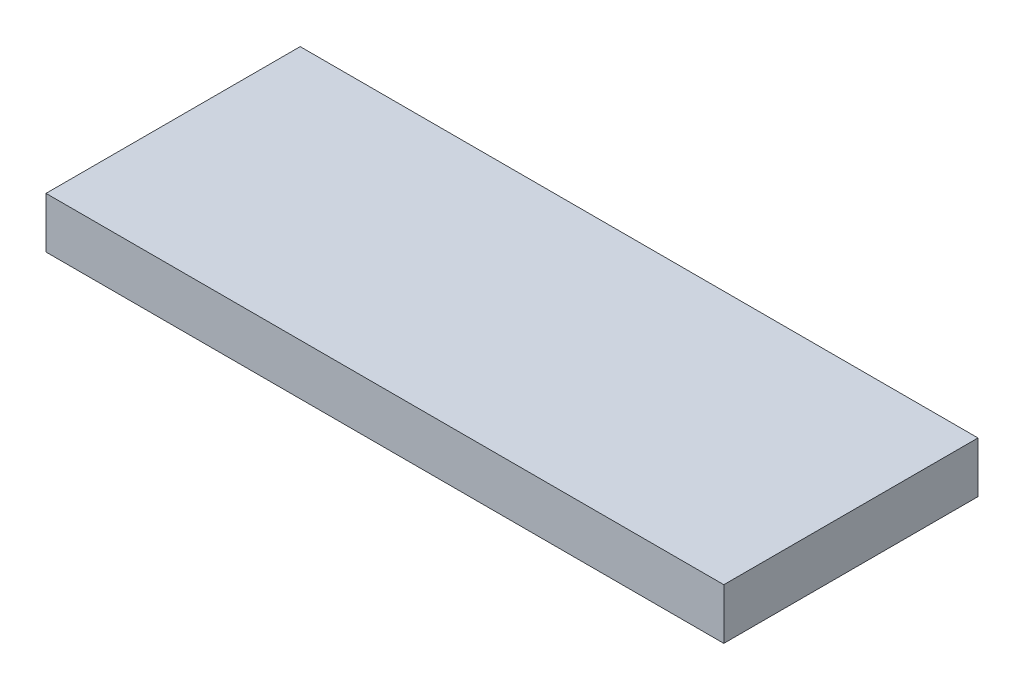
ISO-10303-21;
HEADER;
FILE_DESCRIPTION(('STEP AP214'),'2;1');
FILE_NAME('part.step','',(''),(''),'','','');
FILE_SCHEMA(('AUTOMOTIVE_DESIGN { 1 0 10303 214 1 1 1 1 }'));
ENDSEC;
DATA;
#1=APPLICATION_CONTEXT('core data for automotive mechanical design processes');
#2=APPLICATION_PROTOCOL_DEFINITION('international standard','automotive_design',2000,#1);
#3=PRODUCT_CONTEXT('',#1,'mechanical');
#4=PRODUCT('Part','Part','',(#3));
#5=PRODUCT_RELATED_PRODUCT_CATEGORY('part','',(#4));
#6=PRODUCT_DEFINITION_FORMATION('','',#4);
#7=PRODUCT_DEFINITION_CONTEXT('part definition',#1,'design');
#8=PRODUCT_DEFINITION('design','',#6,#7);
#9=PRODUCT_DEFINITION_SHAPE('','',#8);
#10=(LENGTH_UNIT() NAMED_UNIT(*) SI_UNIT(.MILLI.,.METRE.));
#11=(NAMED_UNIT(*) PLANE_ANGLE_UNIT() SI_UNIT($,.RADIAN.));
#12=(NAMED_UNIT(*) SI_UNIT($,.STERADIAN.) SOLID_ANGLE_UNIT());
#13=UNCERTAINTY_MEASURE_WITH_UNIT(LENGTH_MEASURE(1.E-05),#10,'distance_accuracy_value','');
#14=(GEOMETRIC_REPRESENTATION_CONTEXT(3) GLOBAL_UNCERTAINTY_ASSIGNED_CONTEXT((#13)) GLOBAL_UNIT_ASSIGNED_CONTEXT((#10,
#11,#12)) REPRESENTATION_CONTEXT('',''));
#15=CARTESIAN_POINT('',(0.,0.,0.));
#16=DIRECTION('',(0.,0.,1.));
#17=DIRECTION('',(1.,0.,0.));
#18=AXIS2_PLACEMENT_3D('',#15,#16,#17);
#19=CARTESIAN_POINT('',(20.,-16.2700500005556,-15.));
#20=DIRECTION('',(-1.,0.,0.));
#21=DIRECTION('',(0.,0.,1.));
#22=AXIS2_PLACEMENT_3D('',#19,#20,#21);
#23=PLANE('',#22);
#24=DIRECTION('',(0.,-1.,0.));
#25=VECTOR('',#24,1.);
#26=CARTESIAN_POINT('',(20.,-16.2700500005556,0.));
#27=LINE('',#26,#25);
#28=CARTESIAN_POINT('',(20.,-13.2700500005556,0.));
#29=VERTEX_POINT('',#28);
#30=CARTESIAN_POINT('',(20.,-16.2700500005556,0.));
#31=VERTEX_POINT('',#30);
#32=EDGE_CURVE('E102',#29,#31,#27,.T.);
#33=ORIENTED_EDGE('',*,*,#32,.T.);
#34=DIRECTION('',(0.,0.,1.));
#35=VECTOR('',#34,1.);
#36=CARTESIAN_POINT('',(20.,-16.2700500005556,-15.));
#37=LINE('',#36,#35);
#38=CARTESIAN_POINT('',(20.,-16.2700500005556,-15.));
#39=VERTEX_POINT('',#38);
#40=EDGE_CURVE('E11',#39,#31,#37,.T.);
#41=ORIENTED_EDGE('',*,*,#40,.F.);
#42=DIRECTION('',(0.,-1.,0.));
#43=VECTOR('',#42,1.);
#44=CARTESIAN_POINT('',(20.,-16.2700500005556,-15.));
#45=LINE('',#44,#43);
#46=CARTESIAN_POINT('',(20.,-13.2700500005556,-15.));
#47=VERTEX_POINT('',#46);
#48=EDGE_CURVE('E90',#47,#39,#45,.T.);
#49=ORIENTED_EDGE('',*,*,#48,.F.);
#50=DIRECTION('',(0.,0.,1.));
#51=VECTOR('',#50,1.);
#52=CARTESIAN_POINT('',(20.,-13.2700500005556,-15.));
#53=LINE('',#52,#51);
#54=EDGE_CURVE('E98',#47,#29,#53,.T.);
#55=ORIENTED_EDGE('',*,*,#54,.T.);
#56=EDGE_LOOP('',(#33,#41,#49,#55));
#57=FACE_BOUND('',#56,.T.);
#58=ADVANCED_FACE('F39',(#57),#23,.F.);
#59=CARTESIAN_POINT('',(20.,-16.2700500005556,-15.));
#60=DIRECTION('',(0.,1.,0.));
#61=DIRECTION('',(0.,0.,1.));
#62=AXIS2_PLACEMENT_3D('',#59,#60,#61);
#63=PLANE('',#62);
#64=DIRECTION('',(-1.,0.,0.));
#65=VECTOR('',#64,1.);
#66=CARTESIAN_POINT('',(20.,-16.2700500005556,0.));
#67=LINE('',#66,#65);
#68=CARTESIAN_POINT('',(-20.,-16.2700500005556,0.));
#69=VERTEX_POINT('',#68);
#70=EDGE_CURVE('E94',#31,#69,#67,.T.);
#71=ORIENTED_EDGE('',*,*,#70,.T.);
#72=DIRECTION('',(0.,0.,1.));
#73=VECTOR('',#72,1.);
#74=CARTESIAN_POINT('',(-20.,-16.2700500005556,-15.));
#75=LINE('',#74,#73);
#76=CARTESIAN_POINT('',(-20.,-16.2700500005556,-15.));
#77=VERTEX_POINT('',#76);
#78=EDGE_CURVE('E47',#77,#69,#75,.T.);
#79=ORIENTED_EDGE('',*,*,#78,.F.);
#80=DIRECTION('',(-1.,0.,0.));
#81=VECTOR('',#80,1.);
#82=CARTESIAN_POINT('',(20.,-16.2700500005556,-15.));
#83=LINE('',#82,#81);
#84=EDGE_CURVE('E85',#39,#77,#83,.T.);
#85=ORIENTED_EDGE('',*,*,#84,.F.);
#86=ORIENTED_EDGE('',*,*,#40,.T.);
#87=EDGE_LOOP('',(#71,#79,#85,#86));
#88=FACE_BOUND('',#87,.T.);
#89=ADVANCED_FACE('F93',(#88),#63,.F.);
#90=CARTESIAN_POINT('',(-20.,-16.2700500005556,-15.));
#91=DIRECTION('',(1.,0.,0.));
#92=DIRECTION('',(0.,1.,0.));
#93=AXIS2_PLACEMENT_3D('',#90,#91,#92);
#94=PLANE('',#93);
#95=DIRECTION('',(0.,1.,0.));
#96=VECTOR('',#95,1.);
#97=CARTESIAN_POINT('',(-20.,-16.2700500005556,0.));
#98=LINE('',#97,#96);
#99=CARTESIAN_POINT('',(-20.,-13.2700500005556,0.));
#100=VERTEX_POINT('',#99);
#101=EDGE_CURVE('E72',#69,#100,#98,.T.);
#102=ORIENTED_EDGE('',*,*,#101,.T.);
#103=DIRECTION('',(0.,0.,1.));
#104=VECTOR('',#103,1.);
#105=CARTESIAN_POINT('',(-20.,-13.2700500005556,-15.));
#106=LINE('',#105,#104);
#107=CARTESIAN_POINT('',(-20.,-13.2700500005556,-15.));
#108=VERTEX_POINT('',#107);
#109=EDGE_CURVE('E95',#108,#100,#106,.T.);
#110=ORIENTED_EDGE('',*,*,#109,.F.);
#111=DIRECTION('',(0.,1.,0.));
#112=VECTOR('',#111,1.);
#113=CARTESIAN_POINT('',(-20.,-16.2700500005556,-15.));
#114=LINE('',#113,#112);
#115=EDGE_CURVE('E88',#77,#108,#114,.T.);
#116=ORIENTED_EDGE('',*,*,#115,.F.);
#117=ORIENTED_EDGE('',*,*,#78,.T.);
#118=EDGE_LOOP('',(#102,#110,#116,#117));
#119=FACE_BOUND('',#118,.T.);
#120=ADVANCED_FACE('F96',(#119),#94,.F.);
#121=CARTESIAN_POINT('',(20.,-13.2700500005556,-15.));
#122=DIRECTION('',(0.,-1.,0.));
#123=DIRECTION('',(1.,0.,0.));
#124=AXIS2_PLACEMENT_3D('',#121,#122,#123);
#125=PLANE('',#124);
#126=DIRECTION('',(1.,0.,0.));
#127=VECTOR('',#126,1.);
#128=CARTESIAN_POINT('',(20.,-13.2700500005556,0.));
#129=LINE('',#128,#127);
#130=EDGE_CURVE('E78',#100,#29,#129,.T.);
#131=ORIENTED_EDGE('',*,*,#130,.T.);
#132=ORIENTED_EDGE('',*,*,#54,.F.);
#133=DIRECTION('',(1.,0.,0.));
#134=VECTOR('',#133,1.);
#135=CARTESIAN_POINT('',(20.,-13.2700500005556,-15.));
#136=LINE('',#135,#134);
#137=EDGE_CURVE('E55',#108,#47,#136,.T.);
#138=ORIENTED_EDGE('',*,*,#137,.F.);
#139=ORIENTED_EDGE('',*,*,#109,.T.);
#140=EDGE_LOOP('',(#131,#132,#138,#139));
#141=FACE_BOUND('',#140,.T.);
#142=ADVANCED_FACE('F109',(#141),#125,.F.);
#143=CARTESIAN_POINT('',(0.,0.,-15.));
#144=DIRECTION('',(0.,0.,1.));
#145=DIRECTION('',(1.,0.,0.));
#146=AXIS2_PLACEMENT_3D('',#143,#144,#145);
#147=PLANE('',#146);
#148=ORIENTED_EDGE('',*,*,#48,.T.);
#149=ORIENTED_EDGE('',*,*,#84,.T.);
#150=ORIENTED_EDGE('',*,*,#115,.T.);
#151=ORIENTED_EDGE('',*,*,#137,.T.);
#152=EDGE_LOOP('',(#148,#149,#150,#151));
#153=FACE_BOUND('',#152,.T.);
#154=ADVANCED_FACE('F86',(#153),#147,.F.);
#155=CARTESIAN_POINT('',(0.,0.,0.));
#156=DIRECTION('',(0.,0.,1.));
#157=DIRECTION('',(1.,0.,0.));
#158=AXIS2_PLACEMENT_3D('',#155,#156,#157);
#159=PLANE('',#158);
#160=ORIENTED_EDGE('',*,*,#32,.F.);
#161=ORIENTED_EDGE('',*,*,#130,.F.);
#162=ORIENTED_EDGE('',*,*,#101,.F.);
#163=ORIENTED_EDGE('',*,*,#70,.F.);
#164=EDGE_LOOP('',(#160,#161,#162,#163));
#165=FACE_BOUND('',#164,.T.);
#166=ADVANCED_FACE('F112',(#165),#159,.T.);
#167=CLOSED_SHELL('',(#58,#89,#120,#142,#154,#166));
#168=MANIFOLD_SOLID_BREP('B2',#167);
#169=ADVANCED_BREP_SHAPE_REPRESENTATION('',(#18,#168),#14);
#170=SHAPE_DEFINITION_REPRESENTATION(#9,#169);
ENDSEC;
END-ISO-10303-21;
